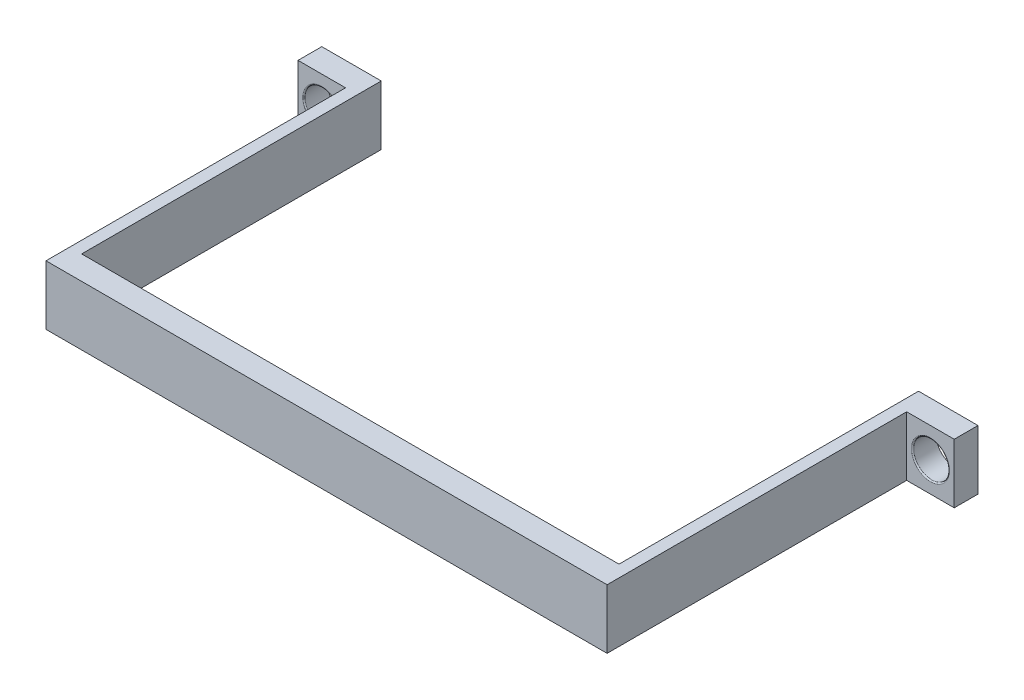
ISO-10303-21;
HEADER;
FILE_DESCRIPTION(('STEP AP214'),'2;1');
FILE_NAME('part.step','',(''),(''),'','','');
FILE_SCHEMA(('AUTOMOTIVE_DESIGN { 1 0 10303 214 1 1 1 1 }'));
ENDSEC;
DATA;
#1=APPLICATION_CONTEXT('core data for automotive mechanical design processes');
#2=APPLICATION_PROTOCOL_DEFINITION('international standard','automotive_design',2000,#1);
#3=PRODUCT_CONTEXT('',#1,'mechanical');
#4=PRODUCT('Part','Part','',(#3));
#5=PRODUCT_RELATED_PRODUCT_CATEGORY('part','',(#4));
#6=PRODUCT_DEFINITION_FORMATION('','',#4);
#7=PRODUCT_DEFINITION_CONTEXT('part definition',#1,'design');
#8=PRODUCT_DEFINITION('design','',#6,#7);
#9=PRODUCT_DEFINITION_SHAPE('','',#8);
#10=(LENGTH_UNIT() NAMED_UNIT(*) SI_UNIT(.MILLI.,.METRE.));
#11=(NAMED_UNIT(*) PLANE_ANGLE_UNIT() SI_UNIT($,.RADIAN.));
#12=(NAMED_UNIT(*) SI_UNIT($,.STERADIAN.) SOLID_ANGLE_UNIT());
#13=UNCERTAINTY_MEASURE_WITH_UNIT(LENGTH_MEASURE(1.E-05),#10,'distance_accuracy_value','');
#14=(GEOMETRIC_REPRESENTATION_CONTEXT(3) GLOBAL_UNCERTAINTY_ASSIGNED_CONTEXT((#13)) GLOBAL_UNIT_ASSIGNED_CONTEXT((#10,
#11,#12)) REPRESENTATION_CONTEXT('',''));
#15=CARTESIAN_POINT('',(0.,0.,0.));
#16=DIRECTION('',(0.,0.,1.));
#17=DIRECTION('',(1.,0.,0.));
#18=AXIS2_PLACEMENT_3D('',#15,#16,#17);
#19=CARTESIAN_POINT('',(0.,0.,0.));
#20=DIRECTION('',(0.,0.,1.));
#21=DIRECTION('',(1.,0.,0.));
#22=AXIS2_PLACEMENT_3D('',#19,#20,#21);
#23=PLANE('',#22);
#24=CARTESIAN_POINT('',(-38.9102250714452,-72.5763777384596,0.));
#25=DIRECTION('',(0.,0.,1.));
#26=DIRECTION('',(1.,0.,0.));
#27=AXIS2_PLACEMENT_3D('',#24,#25,#26);
#28=CIRCLE('',#27,1.5);
#29=CARTESIAN_POINT('',(-37.4102250714452,-72.5763777384596,0.));
#30=VERTEX_POINT('',#29);
#31=EDGE_CURVE('E162',#30,#30,#28,.T.);
#32=ORIENTED_EDGE('',*,*,#31,.T.);
#33=EDGE_LOOP('',(#32));
#34=FACE_BOUND('',#33,.T.);
#35=DIRECTION('',(1.,0.,0.));
#36=VECTOR('',#35,1.);
#37=CARTESIAN_POINT('',(-38.4102250714452,-70.0763777384596,0.));
#38=LINE('',#37,#36);
#39=CARTESIAN_POINT('',(-40.9102250714452,-70.0763777384596,0.));
#40=VERTEX_POINT('',#39);
#41=CARTESIAN_POINT('',(-35.9102250714452,-70.0763777384596,0.));
#42=VERTEX_POINT('',#41);
#43=EDGE_CURVE('E235',#40,#42,#38,.T.);
#44=ORIENTED_EDGE('',*,*,#43,.T.);
#45=DIRECTION('',(0.,-1.,0.));
#46=VECTOR('',#45,1.);
#47=CARTESIAN_POINT('',(-35.9102250714452,-70.0763777384596,0.));
#48=LINE('',#47,#46);
#49=CARTESIAN_POINT('',(-35.9102250714452,-75.0763777384596,0.));
#50=VERTEX_POINT('',#49);
#51=EDGE_CURVE('E216',#42,#50,#48,.T.);
#52=ORIENTED_EDGE('',*,*,#51,.T.);
#53=DIRECTION('',(1.,0.,0.));
#54=VECTOR('',#53,1.);
#55=CARTESIAN_POINT('',(-38.4102250714452,-75.0763777384596,0.));
#56=LINE('',#55,#54);
#57=CARTESIAN_POINT('',(-40.9102250714452,-75.0763777384596,0.));
#58=VERTEX_POINT('',#57);
#59=EDGE_CURVE('E239',#58,#50,#56,.T.);
#60=ORIENTED_EDGE('',*,*,#59,.F.);
#61=DIRECTION('',(0.,-1.,0.));
#62=VECTOR('',#61,1.);
#63=CARTESIAN_POINT('',(-40.9102250714452,-70.0763777384596,0.));
#64=LINE('',#63,#62);
#65=EDGE_CURVE('E171',#40,#58,#64,.T.);
#66=ORIENTED_EDGE('',*,*,#65,.F.);
#67=EDGE_LOOP('',(#44,#52,#60,#66));
#68=FACE_BOUND('',#67,.T.);
#69=ADVANCED_FACE('F47',(#34,#68),#23,.F.);
#70=CARTESIAN_POINT('',(-38.4102250714452,-75.0763777384596,27.2));
#71=DIRECTION('',(0.,1.,0.));
#72=DIRECTION('',(0.,0.,1.));
#73=AXIS2_PLACEMENT_3D('',#70,#71,#72);
#74=PLANE('',#73);
#75=DIRECTION('',(1.,0.,0.));
#76=VECTOR('',#75,1.);
#77=CARTESIAN_POINT('',(11.7897749285548,-75.0763777384596,2.));
#78=LINE('',#77,#76);
#79=CARTESIAN_POINT('',(10.2897749285548,-75.0763777384596,2.));
#80=VERTEX_POINT('',#79);
#81=CARTESIAN_POINT('',(14.2897749285548,-75.0763777384596,2.));
#82=VERTEX_POINT('',#81);
#83=EDGE_CURVE('E137',#80,#82,#78,.T.);
#84=ORIENTED_EDGE('',*,*,#83,.F.);
#85=DIRECTION('',(0.,0.,1.));
#86=VECTOR('',#85,1.);
#87=CARTESIAN_POINT('',(10.2897749285548,-75.0763777384596,2.));
#88=LINE('',#87,#86);
#89=CARTESIAN_POINT('',(10.2897749285548,-75.0763777384596,27.2));
#90=VERTEX_POINT('',#89);
#91=EDGE_CURVE('E188',#80,#90,#88,.T.);
#92=ORIENTED_EDGE('',*,*,#91,.T.);
#93=DIRECTION('',(1.,0.,0.));
#94=VECTOR('',#93,1.);
#95=CARTESIAN_POINT('',(-38.4102250714452,-75.0763777384596,27.2));
#96=LINE('',#95,#94);
#97=CARTESIAN_POINT('',(-36.9102250714452,-75.0763777384596,27.2));
#98=VERTEX_POINT('',#97);
#99=EDGE_CURVE('E231',#98,#90,#96,.T.);
#100=ORIENTED_EDGE('',*,*,#99,.F.);
#101=DIRECTION('',(0.,0.,1.));
#102=VECTOR('',#101,1.);
#103=CARTESIAN_POINT('',(-36.9102250714452,-75.0763777384596,2.));
#104=LINE('',#103,#102);
#105=CARTESIAN_POINT('',(-36.9102250714452,-75.0763777384596,2.));
#106=VERTEX_POINT('',#105);
#107=EDGE_CURVE('E70',#106,#98,#104,.T.);
#108=ORIENTED_EDGE('',*,*,#107,.F.);
#109=DIRECTION('',(1.,0.,0.));
#110=VECTOR('',#109,1.);
#111=CARTESIAN_POINT('',(-38.4102250714452,-75.0763777384596,2.));
#112=LINE('',#111,#110);
#113=CARTESIAN_POINT('',(-40.9102250714452,-75.0763777384596,2.));
#114=VERTEX_POINT('',#113);
#115=EDGE_CURVE('E192',#114,#106,#112,.T.);
#116=ORIENTED_EDGE('',*,*,#115,.F.);
#117=DIRECTION('',(0.,0.,1.));
#118=VECTOR('',#117,1.);
#119=CARTESIAN_POINT('',(-40.9102250714452,-75.0763777384596,0.));
#120=LINE('',#119,#118);
#121=EDGE_CURVE('E174',#58,#114,#120,.T.);
#122=ORIENTED_EDGE('',*,*,#121,.F.);
#123=ORIENTED_EDGE('',*,*,#59,.T.);
#124=DIRECTION('',(0.,0.,-1.));
#125=VECTOR('',#124,1.);
#126=CARTESIAN_POINT('',(-35.9102250714452,-75.0763777384596,0.));
#127=LINE('',#126,#125);
#128=CARTESIAN_POINT('',(-35.9102250714452,-75.0763777384596,25.2));
#129=VERTEX_POINT('',#128);
#130=EDGE_CURVE('E204',#129,#50,#127,.T.);
#131=ORIENTED_EDGE('',*,*,#130,.F.);
#132=DIRECTION('',(-1.,0.,0.));
#133=VECTOR('',#132,1.);
#134=CARTESIAN_POINT('',(-35.9102250714452,-75.0763777384596,25.2));
#135=LINE('',#134,#133);
#136=CARTESIAN_POINT('',(9.28977492855477,-75.0763777384596,25.2));
#137=VERTEX_POINT('',#136);
#138=EDGE_CURVE('E210',#137,#129,#135,.T.);
#139=ORIENTED_EDGE('',*,*,#138,.F.);
#140=DIRECTION('',(0.,0.,1.));
#141=VECTOR('',#140,1.);
#142=CARTESIAN_POINT('',(9.28977492855477,-75.0763777384596,0.));
#143=LINE('',#142,#141);
#144=CARTESIAN_POINT('',(9.28977492855477,-75.0763777384596,0.));
#145=VERTEX_POINT('',#144);
#146=EDGE_CURVE('E218',#145,#137,#143,.T.);
#147=ORIENTED_EDGE('',*,*,#146,.F.);
#148=CARTESIAN_POINT('',(14.2897749285548,-75.0763777384596,0.));
#149=VERTEX_POINT('',#148);
#150=EDGE_CURVE('E152',#145,#149,#56,.T.);
#151=ORIENTED_EDGE('',*,*,#150,.T.);
#152=DIRECTION('',(0.,0.,-1.));
#153=VECTOR('',#152,1.);
#154=CARTESIAN_POINT('',(14.2897749285548,-75.0763777384596,2.));
#155=LINE('',#154,#153);
#156=EDGE_CURVE('E148',#82,#149,#155,.T.);
#157=ORIENTED_EDGE('',*,*,#156,.F.);
#158=EDGE_LOOP('',(#84,#92,#100,#108,#116,#122,#123,#131,#139,#147,#151,#157));
#159=FACE_BOUND('',#158,.T.);
#160=ADVANCED_FACE('F149',(#159),#74,.F.);
#161=CARTESIAN_POINT('',(-38.4102250714452,-70.0763777384596,27.2));
#162=DIRECTION('',(0.,1.,0.));
#163=DIRECTION('',(0.,0.,1.));
#164=AXIS2_PLACEMENT_3D('',#161,#162,#163);
#165=PLANE('',#164);
#166=DIRECTION('',(0.,0.,1.));
#167=VECTOR('',#166,1.);
#168=CARTESIAN_POINT('',(10.2897749285548,-70.0763777384596,2.));
#169=LINE('',#168,#167);
#170=CARTESIAN_POINT('',(10.2897749285548,-70.0763777384596,2.));
#171=VERTEX_POINT('',#170);
#172=CARTESIAN_POINT('',(10.2897749285548,-70.0763777384596,27.2));
#173=VERTEX_POINT('',#172);
#174=EDGE_CURVE('E62',#171,#173,#169,.T.);
#175=ORIENTED_EDGE('',*,*,#174,.F.);
#176=DIRECTION('',(-1.,0.,0.));
#177=VECTOR('',#176,1.);
#178=CARTESIAN_POINT('',(11.7897749285548,-70.0763777384596,2.));
#179=LINE('',#178,#177);
#180=CARTESIAN_POINT('',(14.2897749285548,-70.0763777384596,2.));
#181=VERTEX_POINT('',#180);
#182=EDGE_CURVE('E184',#181,#171,#179,.T.);
#183=ORIENTED_EDGE('',*,*,#182,.F.);
#184=DIRECTION('',(0.,0.,1.));
#185=VECTOR('',#184,1.);
#186=CARTESIAN_POINT('',(14.2897749285548,-70.0763777384596,2.));
#187=LINE('',#186,#185);
#188=CARTESIAN_POINT('',(14.2897749285548,-70.0763777384596,0.));
#189=VERTEX_POINT('',#188);
#190=EDGE_CURVE('E161',#189,#181,#187,.T.);
#191=ORIENTED_EDGE('',*,*,#190,.F.);
#192=CARTESIAN_POINT('',(9.28977492855477,-70.0763777384596,0.));
#193=VERTEX_POINT('',#192);
#194=EDGE_CURVE('E242',#193,#189,#38,.T.);
#195=ORIENTED_EDGE('',*,*,#194,.F.);
#196=DIRECTION('',(0.,0.,1.));
#197=VECTOR('',#196,1.);
#198=CARTESIAN_POINT('',(9.28977492855477,-70.0763777384596,0.));
#199=LINE('',#198,#197);
#200=CARTESIAN_POINT('',(9.28977492855477,-70.0763777384596,25.2));
#201=VERTEX_POINT('',#200);
#202=EDGE_CURVE('E209',#193,#201,#199,.T.);
#203=ORIENTED_EDGE('',*,*,#202,.T.);
#204=DIRECTION('',(-1.,0.,0.));
#205=VECTOR('',#204,1.);
#206=CARTESIAN_POINT('',(-35.9102250714452,-70.0763777384596,25.2));
#207=LINE('',#206,#205);
#208=CARTESIAN_POINT('',(-35.9102250714452,-70.0763777384596,25.2));
#209=VERTEX_POINT('',#208);
#210=EDGE_CURVE('E213',#201,#209,#207,.T.);
#211=ORIENTED_EDGE('',*,*,#210,.T.);
#212=DIRECTION('',(0.,0.,-1.));
#213=VECTOR('',#212,1.);
#214=CARTESIAN_POINT('',(-35.9102250714452,-70.0763777384596,0.));
#215=LINE('',#214,#213);
#216=EDGE_CURVE('E206',#209,#42,#215,.T.);
#217=ORIENTED_EDGE('',*,*,#216,.T.);
#218=ORIENTED_EDGE('',*,*,#43,.F.);
#219=DIRECTION('',(0.,0.,-1.));
#220=VECTOR('',#219,1.);
#221=CARTESIAN_POINT('',(-40.9102250714452,-70.0763777384596,0.));
#222=LINE('',#221,#220);
#223=CARTESIAN_POINT('',(-40.9102250714452,-70.0763777384596,2.));
#224=VERTEX_POINT('',#223);
#225=EDGE_CURVE('E180',#224,#40,#222,.T.);
#226=ORIENTED_EDGE('',*,*,#225,.F.);
#227=DIRECTION('',(-1.,0.,0.));
#228=VECTOR('',#227,1.);
#229=CARTESIAN_POINT('',(-38.4102250714452,-70.0763777384596,2.));
#230=LINE('',#229,#228);
#231=CARTESIAN_POINT('',(-36.9102250714452,-70.0763777384596,2.));
#232=VERTEX_POINT('',#231);
#233=EDGE_CURVE('E198',#232,#224,#230,.T.);
#234=ORIENTED_EDGE('',*,*,#233,.F.);
#235=DIRECTION('',(0.,0.,1.));
#236=VECTOR('',#235,1.);
#237=CARTESIAN_POINT('',(-36.9102250714452,-70.0763777384596,2.));
#238=LINE('',#237,#236);
#239=CARTESIAN_POINT('',(-36.9102250714452,-70.0763777384596,27.2));
#240=VERTEX_POINT('',#239);
#241=EDGE_CURVE('E201',#232,#240,#238,.T.);
#242=ORIENTED_EDGE('',*,*,#241,.T.);
#243=DIRECTION('',(1.,0.,0.));
#244=VECTOR('',#243,1.);
#245=CARTESIAN_POINT('',(-38.4102250714452,-70.0763777384596,27.2));
#246=LINE('',#245,#244);
#247=EDGE_CURVE('E234',#240,#173,#246,.T.);
#248=ORIENTED_EDGE('',*,*,#247,.T.);
#249=EDGE_LOOP('',(#175,#183,#191,#195,#203,#211,#217,#218,#226,#234,#242,#248));
#250=FACE_BOUND('',#249,.T.);
#251=ADVANCED_FACE('F272',(#250),#165,.T.);
#252=CARTESIAN_POINT('',(0.,0.,27.2));
#253=DIRECTION('',(0.,0.,1.));
#254=DIRECTION('',(1.,0.,0.));
#255=AXIS2_PLACEMENT_3D('',#252,#253,#254);
#256=PLANE('',#255);
#257=DIRECTION('',(0.,-1.,0.));
#258=VECTOR('',#257,1.);
#259=CARTESIAN_POINT('',(10.2897749285548,-70.0763777384596,27.2));
#260=LINE('',#259,#258);
#261=EDGE_CURVE('E183',#173,#90,#260,.T.);
#262=ORIENTED_EDGE('',*,*,#261,.F.);
#263=ORIENTED_EDGE('',*,*,#247,.F.);
#264=DIRECTION('',(0.,1.,0.));
#265=VECTOR('',#264,1.);
#266=CARTESIAN_POINT('',(-36.9102250714452,-70.0763777384596,27.2));
#267=LINE('',#266,#265);
#268=EDGE_CURVE('E190',#98,#240,#267,.T.);
#269=ORIENTED_EDGE('',*,*,#268,.F.);
#270=ORIENTED_EDGE('',*,*,#99,.T.);
#271=EDGE_LOOP('',(#262,#263,#269,#270));
#272=FACE_BOUND('',#271,.T.);
#273=ADVANCED_FACE('F279',(#272),#256,.T.);
#274=CARTESIAN_POINT('',(12.2897749285548,-72.5763777384596,0.));
#275=DIRECTION('',(0.,0.,1.));
#276=DIRECTION('',(1.,0.,0.));
#277=AXIS2_PLACEMENT_3D('',#274,#275,#276);
#278=CIRCLE('',#277,1.5);
#279=CARTESIAN_POINT('',(13.7897749285548,-72.5763777384596,0.));
#280=VERTEX_POINT('',#279);
#281=EDGE_CURVE('E165',#280,#280,#278,.T.);
#282=ORIENTED_EDGE('',*,*,#281,.T.);
#283=EDGE_LOOP('',(#282));
#284=FACE_BOUND('',#283,.T.);
#285=ORIENTED_EDGE('',*,*,#150,.F.);
#286=DIRECTION('',(0.,-1.,0.));
#287=VECTOR('',#286,1.);
#288=CARTESIAN_POINT('',(9.28977492855477,-70.0763777384596,0.));
#289=LINE('',#288,#287);
#290=EDGE_CURVE('E227',#193,#145,#289,.T.);
#291=ORIENTED_EDGE('',*,*,#290,.F.);
#292=ORIENTED_EDGE('',*,*,#194,.T.);
#293=DIRECTION('',(0.,1.,0.));
#294=VECTOR('',#293,1.);
#295=CARTESIAN_POINT('',(14.2897749285548,-70.0763777384596,0.));
#296=LINE('',#295,#294);
#297=EDGE_CURVE('E156',#149,#189,#296,.T.);
#298=ORIENTED_EDGE('',*,*,#297,.F.);
#299=EDGE_LOOP('',(#285,#291,#292,#298));
#300=FACE_BOUND('',#299,.T.);
#301=ADVANCED_FACE('F266',(#284,#300),#23,.F.);
#302=CARTESIAN_POINT('',(-35.9102250714452,-70.0763777384596,0.));
#303=DIRECTION('',(-1.,0.,0.));
#304=DIRECTION('',(0.,0.,1.));
#305=AXIS2_PLACEMENT_3D('',#302,#303,#304);
#306=PLANE('',#305);
#307=ORIENTED_EDGE('',*,*,#130,.T.);
#308=ORIENTED_EDGE('',*,*,#51,.F.);
#309=ORIENTED_EDGE('',*,*,#216,.F.);
#310=DIRECTION('',(0.,-1.,0.));
#311=VECTOR('',#310,1.);
#312=CARTESIAN_POINT('',(-35.9102250714452,-70.0763777384596,25.2));
#313=LINE('',#312,#311);
#314=EDGE_CURVE('E223',#209,#129,#313,.T.);
#315=ORIENTED_EDGE('',*,*,#314,.T.);
#316=EDGE_LOOP('',(#307,#308,#309,#315));
#317=FACE_BOUND('',#316,.T.);
#318=ADVANCED_FACE('F278',(#317),#306,.F.);
#319=CARTESIAN_POINT('',(-35.9102250714452,-70.0763777384596,25.2));
#320=DIRECTION('',(0.,0.,1.));
#321=DIRECTION('',(1.,0.,0.));
#322=AXIS2_PLACEMENT_3D('',#319,#320,#321);
#323=PLANE('',#322);
#324=ORIENTED_EDGE('',*,*,#138,.T.);
#325=ORIENTED_EDGE('',*,*,#314,.F.);
#326=ORIENTED_EDGE('',*,*,#210,.F.);
#327=DIRECTION('',(0.,-1.,0.));
#328=VECTOR('',#327,1.);
#329=CARTESIAN_POINT('',(9.28977492855477,-70.0763777384596,25.2));
#330=LINE('',#329,#328);
#331=EDGE_CURVE('E225',#201,#137,#330,.T.);
#332=ORIENTED_EDGE('',*,*,#331,.T.);
#333=EDGE_LOOP('',(#324,#325,#326,#332));
#334=FACE_BOUND('',#333,.T.);
#335=ADVANCED_FACE('F286',(#334),#323,.F.);
#336=CARTESIAN_POINT('',(9.28977492855477,-70.0763777384596,0.));
#337=DIRECTION('',(1.,0.,0.));
#338=DIRECTION('',(0.,0.,-1.));
#339=AXIS2_PLACEMENT_3D('',#336,#337,#338);
#340=PLANE('',#339);
#341=ORIENTED_EDGE('',*,*,#146,.T.);
#342=ORIENTED_EDGE('',*,*,#331,.F.);
#343=ORIENTED_EDGE('',*,*,#202,.F.);
#344=ORIENTED_EDGE('',*,*,#290,.T.);
#345=EDGE_LOOP('',(#341,#342,#343,#344));
#346=FACE_BOUND('',#345,.T.);
#347=ADVANCED_FACE('F315',(#346),#340,.F.);
#348=CARTESIAN_POINT('',(-36.9102250714452,-70.0763777384596,2.));
#349=DIRECTION('',(1.,0.,0.));
#350=DIRECTION('',(0.,0.,-1.));
#351=AXIS2_PLACEMENT_3D('',#348,#349,#350);
#352=PLANE('',#351);
#353=ORIENTED_EDGE('',*,*,#268,.T.);
#354=ORIENTED_EDGE('',*,*,#241,.F.);
#355=DIRECTION('',(0.,1.,0.));
#356=VECTOR('',#355,1.);
#357=CARTESIAN_POINT('',(-36.9102250714452,-70.0763777384596,2.));
#358=LINE('',#357,#356);
#359=EDGE_CURVE('E195',#106,#232,#358,.T.);
#360=ORIENTED_EDGE('',*,*,#359,.F.);
#361=ORIENTED_EDGE('',*,*,#107,.T.);
#362=EDGE_LOOP('',(#353,#354,#360,#361));
#363=FACE_BOUND('',#362,.T.);
#364=ADVANCED_FACE('F317',(#363),#352,.F.);
#365=CARTESIAN_POINT('',(0.,0.,2.));
#366=DIRECTION('',(0.,0.,1.));
#367=DIRECTION('',(1.,0.,0.));
#368=AXIS2_PLACEMENT_3D('',#365,#366,#367);
#369=PLANE('',#368);
#370=CARTESIAN_POINT('',(-38.9102250714452,-72.5763777384596,2.));
#371=DIRECTION('',(0.,0.,1.));
#372=DIRECTION('',(1.,0.,0.));
#373=AXIS2_PLACEMENT_3D('',#370,#371,#372);
#374=CIRCLE('',#373,1.6);
#375=CARTESIAN_POINT('',(-37.3102250714452,-72.5763777384596,2.));
#376=VERTEX_POINT('',#375);
#377=EDGE_CURVE('E247',#376,#376,#374,.F.);
#378=ORIENTED_EDGE('',*,*,#377,.T.);
#379=EDGE_LOOP('',(#378));
#380=FACE_BOUND('',#379,.T.);
#381=ORIENTED_EDGE('',*,*,#233,.T.);
#382=DIRECTION('',(0.,1.,0.));
#383=VECTOR('',#382,1.);
#384=CARTESIAN_POINT('',(-40.9102250714452,-70.0763777384596,2.));
#385=LINE('',#384,#383);
#386=EDGE_CURVE('E177',#114,#224,#385,.T.);
#387=ORIENTED_EDGE('',*,*,#386,.F.);
#388=ORIENTED_EDGE('',*,*,#115,.T.);
#389=ORIENTED_EDGE('',*,*,#359,.T.);
#390=EDGE_LOOP('',(#381,#387,#388,#389));
#391=FACE_BOUND('',#390,.T.);
#392=ADVANCED_FACE('F308',(#380,#391),#369,.T.);
#393=CARTESIAN_POINT('',(10.2897749285548,-70.0763777384596,2.));
#394=DIRECTION('',(-1.,0.,0.));
#395=DIRECTION('',(0.,0.,1.));
#396=AXIS2_PLACEMENT_3D('',#393,#394,#395);
#397=PLANE('',#396);
#398=ORIENTED_EDGE('',*,*,#261,.T.);
#399=ORIENTED_EDGE('',*,*,#91,.F.);
#400=DIRECTION('',(0.,-1.,0.));
#401=VECTOR('',#400,1.);
#402=CARTESIAN_POINT('',(10.2897749285548,-70.0763777384596,2.));
#403=LINE('',#402,#401);
#404=EDGE_CURVE('E143',#171,#80,#403,.T.);
#405=ORIENTED_EDGE('',*,*,#404,.F.);
#406=ORIENTED_EDGE('',*,*,#174,.T.);
#407=EDGE_LOOP('',(#398,#399,#405,#406));
#408=FACE_BOUND('',#407,.T.);
#409=ADVANCED_FACE('F300',(#408),#397,.F.);
#410=CARTESIAN_POINT('',(0.,0.,2.));
#411=DIRECTION('',(0.,0.,-1.));
#412=DIRECTION('',(-1.,0.,0.));
#413=AXIS2_PLACEMENT_3D('',#410,#411,#412);
#414=PLANE('',#413);
#415=CARTESIAN_POINT('',(12.2897749285548,-72.5763777384596,2.));
#416=DIRECTION('',(0.,0.,-1.));
#417=DIRECTION('',(-1.,0.,0.));
#418=AXIS2_PLACEMENT_3D('',#415,#416,#417);
#419=CIRCLE('',#418,1.6);
#420=CARTESIAN_POINT('',(10.6897749285548,-72.5763777384596,2.));
#421=VERTEX_POINT('',#420);
#422=EDGE_CURVE('E11',#421,#421,#419,.T.);
#423=ORIENTED_EDGE('',*,*,#422,.T.);
#424=EDGE_LOOP('',(#423));
#425=FACE_BOUND('',#424,.T.);
#426=ORIENTED_EDGE('',*,*,#83,.T.);
#427=DIRECTION('',(0.,-1.,0.));
#428=VECTOR('',#427,1.);
#429=CARTESIAN_POINT('',(14.2897749285548,-70.0763777384596,2.));
#430=LINE('',#429,#428);
#431=EDGE_CURVE('E142',#181,#82,#430,.T.);
#432=ORIENTED_EDGE('',*,*,#431,.F.);
#433=ORIENTED_EDGE('',*,*,#182,.T.);
#434=ORIENTED_EDGE('',*,*,#404,.T.);
#435=EDGE_LOOP('',(#426,#432,#433,#434));
#436=FACE_BOUND('',#435,.T.);
#437=ADVANCED_FACE('F139',(#425,#436),#414,.F.);
#438=CARTESIAN_POINT('',(-40.9102250714452,0.,0.));
#439=DIRECTION('',(-1.,0.,0.));
#440=DIRECTION('',(0.,0.,1.));
#441=AXIS2_PLACEMENT_3D('',#438,#439,#440);
#442=PLANE('',#441);
#443=ORIENTED_EDGE('',*,*,#65,.T.);
#444=ORIENTED_EDGE('',*,*,#121,.T.);
#445=ORIENTED_EDGE('',*,*,#386,.T.);
#446=ORIENTED_EDGE('',*,*,#225,.T.);
#447=EDGE_LOOP('',(#443,#444,#445,#446));
#448=FACE_BOUND('',#447,.T.);
#449=ADVANCED_FACE('F305',(#448),#442,.T.);
#450=CARTESIAN_POINT('',(14.2897749285548,0.,0.));
#451=DIRECTION('',(1.,0.,0.));
#452=DIRECTION('',(0.,0.,-1.));
#453=AXIS2_PLACEMENT_3D('',#450,#451,#452);
#454=PLANE('',#453);
#455=ORIENTED_EDGE('',*,*,#431,.T.);
#456=ORIENTED_EDGE('',*,*,#156,.T.);
#457=ORIENTED_EDGE('',*,*,#297,.T.);
#458=ORIENTED_EDGE('',*,*,#190,.T.);
#459=EDGE_LOOP('',(#455,#456,#457,#458));
#460=FACE_BOUND('',#459,.T.);
#461=ADVANCED_FACE('F159',(#460),#454,.T.);
#462=CARTESIAN_POINT('',(-38.9102250714452,-72.5763777384596,-0.500000000000002));
#463=DIRECTION('',(0.,0.,1.));
#464=DIRECTION('',(1.,0.,0.));
#465=AXIS2_PLACEMENT_3D('',#462,#463,#464);
#466=CYLINDRICAL_SURFACE('',#465,1.5);
#467=CARTESIAN_POINT('',(-38.9102250714452,-72.5763777384596,1.9));
#468=DIRECTION('',(0.,0.,1.));
#469=DIRECTION('',(1.,0.,0.));
#470=AXIS2_PLACEMENT_3D('',#467,#468,#469);
#471=CIRCLE('',#470,1.5);
#472=CARTESIAN_POINT('',(-37.4102250714452,-72.5763777384596,1.9));
#473=VERTEX_POINT('',#472);
#474=EDGE_CURVE('E238',#473,#473,#471,.T.);
#475=ORIENTED_EDGE('',*,*,#474,.T.);
#476=EDGE_LOOP('',(#475));
#477=FACE_BOUND('',#476,.T.);
#478=ORIENTED_EDGE('',*,*,#31,.F.);
#479=EDGE_LOOP('',(#478));
#480=FACE_BOUND('',#479,.T.);
#481=ADVANCED_FACE('F335',(#477,#480),#466,.F.);
#482=CARTESIAN_POINT('',(-38.9102250714452,-72.5763777384596,1.9));
#483=DIRECTION('',(0.,0.,1.));
#484=DIRECTION('',(1.,0.,0.));
#485=AXIS2_PLACEMENT_3D('',#482,#483,#484);
#486=TOROIDAL_SURFACE('',#485,1.6,0.1);
#487=ORIENTED_EDGE('',*,*,#377,.F.);
#488=EDGE_LOOP('',(#487));
#489=FACE_BOUND('',#488,.T.);
#490=ORIENTED_EDGE('',*,*,#474,.F.);
#491=EDGE_LOOP('',(#490));
#492=FACE_BOUND('',#491,.T.);
#493=ADVANCED_FACE('F260',(#489,#492),#486,.T.);
#494=CARTESIAN_POINT('',(12.2897749285548,-72.5763777384596,-0.500000000000002));
#495=DIRECTION('',(0.,0.,1.));
#496=DIRECTION('',(1.,0.,0.));
#497=AXIS2_PLACEMENT_3D('',#494,#495,#496);
#498=CYLINDRICAL_SURFACE('',#497,1.5);
#499=CARTESIAN_POINT('',(12.2897749285548,-72.5763777384596,1.9));
#500=DIRECTION('',(0.,0.,-1.));
#501=DIRECTION('',(-1.,0.,0.));
#502=AXIS2_PLACEMENT_3D('',#499,#500,#501);
#503=CIRCLE('',#502,1.5);
#504=CARTESIAN_POINT('',(10.7897749285548,-72.5763777384596,1.9));
#505=VERTEX_POINT('',#504);
#506=EDGE_CURVE('E55',#505,#505,#503,.F.);
#507=ORIENTED_EDGE('',*,*,#506,.T.);
#508=EDGE_LOOP('',(#507));
#509=FACE_BOUND('',#508,.T.);
#510=ORIENTED_EDGE('',*,*,#281,.F.);
#511=EDGE_LOOP('',(#510));
#512=FACE_BOUND('',#511,.T.);
#513=ADVANCED_FACE('F252',(#509,#512),#498,.F.);
#514=CARTESIAN_POINT('',(12.2897749285548,-72.5763777384596,1.9));
#515=DIRECTION('',(0.,0.,-1.));
#516=DIRECTION('',(-1.,0.,0.));
#517=AXIS2_PLACEMENT_3D('',#514,#515,#516);
#518=TOROIDAL_SURFACE('',#517,1.6,0.1);
#519=ORIENTED_EDGE('',*,*,#422,.F.);
#520=EDGE_LOOP('',(#519));
#521=FACE_BOUND('',#520,.T.);
#522=ORIENTED_EDGE('',*,*,#506,.F.);
#523=EDGE_LOOP('',(#522));
#524=FACE_BOUND('',#523,.T.);
#525=ADVANCED_FACE('F49',(#521,#524),#518,.T.);
#526=CLOSED_SHELL('',(#69,#160,#251,#273,#301,#318,#335,#347,#364,#392,#409,#437,#449,#461,#481,
#493,#513,#525));
#527=MANIFOLD_SOLID_BREP('B2',#526);
#528=ADVANCED_BREP_SHAPE_REPRESENTATION('',(#18,#527),#14);
#529=SHAPE_DEFINITION_REPRESENTATION(#9,#528);
ENDSEC;
END-ISO-10303-21;
